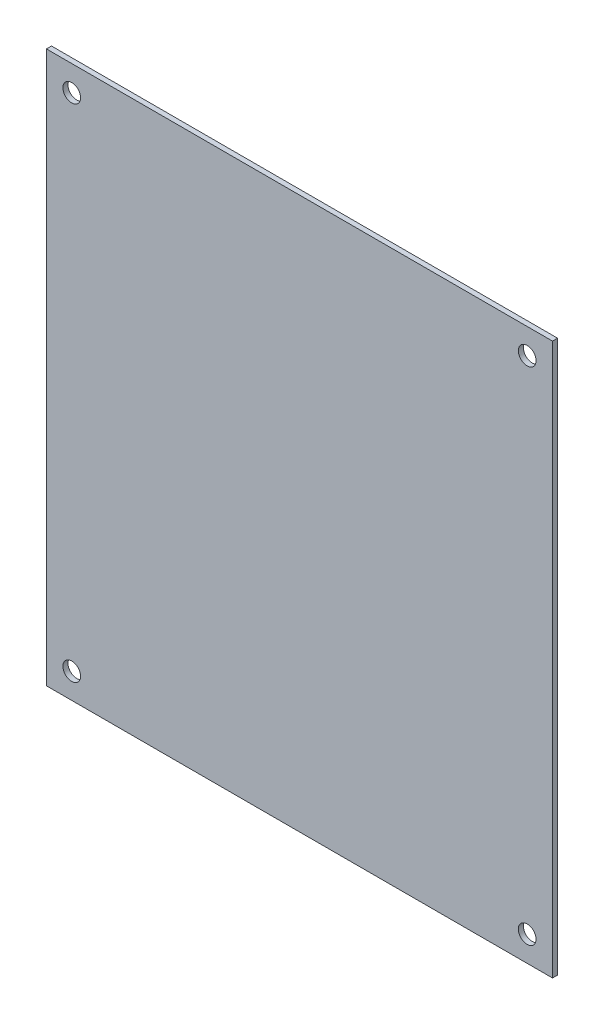
ISO-10303-21;
HEADER;
FILE_DESCRIPTION(('STEP AP214'),'2;1');
FILE_NAME('part.step','',(''),(''),'','','');
FILE_SCHEMA(('AUTOMOTIVE_DESIGN { 1 0 10303 214 1 1 1 1 }'));
ENDSEC;
DATA;
#1=APPLICATION_CONTEXT('core data for automotive mechanical design processes');
#2=APPLICATION_PROTOCOL_DEFINITION('international standard','automotive_design',2000,#1);
#3=PRODUCT_CONTEXT('',#1,'mechanical');
#4=PRODUCT('Part','Part','',(#3));
#5=PRODUCT_RELATED_PRODUCT_CATEGORY('part','',(#4));
#6=PRODUCT_DEFINITION_FORMATION('','',#4);
#7=PRODUCT_DEFINITION_CONTEXT('part definition',#1,'design');
#8=PRODUCT_DEFINITION('design','',#6,#7);
#9=PRODUCT_DEFINITION_SHAPE('','',#8);
#10=(LENGTH_UNIT() NAMED_UNIT(*) SI_UNIT(.MILLI.,.METRE.));
#11=(NAMED_UNIT(*) PLANE_ANGLE_UNIT() SI_UNIT($,.RADIAN.));
#12=(NAMED_UNIT(*) SI_UNIT($,.STERADIAN.) SOLID_ANGLE_UNIT());
#13=UNCERTAINTY_MEASURE_WITH_UNIT(LENGTH_MEASURE(1.E-05),#10,'distance_accuracy_value','');
#14=(GEOMETRIC_REPRESENTATION_CONTEXT(3) GLOBAL_UNCERTAINTY_ASSIGNED_CONTEXT((#13)) GLOBAL_UNIT_ASSIGNED_CONTEXT((#10,
#11,#12)) REPRESENTATION_CONTEXT('',''));
#15=CARTESIAN_POINT('',(0.,0.,0.));
#16=DIRECTION('',(0.,0.,1.));
#17=DIRECTION('',(1.,0.,0.));
#18=AXIS2_PLACEMENT_3D('',#15,#16,#17);
#19=CARTESIAN_POINT('',(0.,0.,2.));
#20=DIRECTION('',(1.,0.,0.));
#21=DIRECTION('',(0.,0.,-1.));
#22=AXIS2_PLACEMENT_3D('',#19,#20,#21);
#23=PLANE('',#22);
#24=DIRECTION('',(0.,-1.,0.));
#25=VECTOR('',#24,1.);
#26=CARTESIAN_POINT('',(0.,0.,0.));
#27=LINE('',#26,#25);
#28=CARTESIAN_POINT('',(0.,218.,0.));
#29=VERTEX_POINT('',#28);
#30=CARTESIAN_POINT('',(0.,0.,0.));
#31=VERTEX_POINT('',#30);
#32=EDGE_CURVE('E102',#29,#31,#27,.T.);
#33=ORIENTED_EDGE('',*,*,#32,.T.);
#34=DIRECTION('',(0.,0.,-1.));
#35=VECTOR('',#34,1.);
#36=CARTESIAN_POINT('',(0.,0.,2.));
#37=LINE('',#36,#35);
#38=CARTESIAN_POINT('',(0.,0.,2.));
#39=VERTEX_POINT('',#38);
#40=EDGE_CURVE('E11',#39,#31,#37,.T.);
#41=ORIENTED_EDGE('',*,*,#40,.F.);
#42=DIRECTION('',(0.,-1.,0.));
#43=VECTOR('',#42,1.);
#44=CARTESIAN_POINT('',(0.,0.,2.));
#45=LINE('',#44,#43);
#46=CARTESIAN_POINT('',(0.,218.,2.));
#47=VERTEX_POINT('',#46);
#48=EDGE_CURVE('E90',#47,#39,#45,.T.);
#49=ORIENTED_EDGE('',*,*,#48,.F.);
#50=DIRECTION('',(0.,0.,-1.));
#51=VECTOR('',#50,1.);
#52=CARTESIAN_POINT('',(0.,218.,2.));
#53=LINE('',#52,#51);
#54=EDGE_CURVE('E98',#47,#29,#53,.T.);
#55=ORIENTED_EDGE('',*,*,#54,.T.);
#56=EDGE_LOOP('',(#33,#41,#49,#55));
#57=FACE_BOUND('',#56,.T.);
#58=ADVANCED_FACE('F39',(#57),#23,.F.);
#59=CARTESIAN_POINT('',(0.,0.,2.));
#60=DIRECTION('',(0.,1.,0.));
#61=DIRECTION('',(0.,0.,1.));
#62=AXIS2_PLACEMENT_3D('',#59,#60,#61);
#63=PLANE('',#62);
#64=DIRECTION('',(1.,0.,0.));
#65=VECTOR('',#64,1.);
#66=CARTESIAN_POINT('',(0.,0.,0.));
#67=LINE('',#66,#65);
#68=CARTESIAN_POINT('',(200.,0.,0.));
#69=VERTEX_POINT('',#68);
#70=EDGE_CURVE('E94',#31,#69,#67,.T.);
#71=ORIENTED_EDGE('',*,*,#70,.T.);
#72=DIRECTION('',(0.,0.,-1.));
#73=VECTOR('',#72,1.);
#74=CARTESIAN_POINT('',(200.,0.,2.));
#75=LINE('',#74,#73);
#76=CARTESIAN_POINT('',(200.,0.,2.));
#77=VERTEX_POINT('',#76);
#78=EDGE_CURVE('E47',#77,#69,#75,.T.);
#79=ORIENTED_EDGE('',*,*,#78,.F.);
#80=DIRECTION('',(1.,0.,0.));
#81=VECTOR('',#80,1.);
#82=CARTESIAN_POINT('',(0.,0.,2.));
#83=LINE('',#82,#81);
#84=EDGE_CURVE('E85',#39,#77,#83,.T.);
#85=ORIENTED_EDGE('',*,*,#84,.F.);
#86=ORIENTED_EDGE('',*,*,#40,.T.);
#87=EDGE_LOOP('',(#71,#79,#85,#86));
#88=FACE_BOUND('',#87,.T.);
#89=ADVANCED_FACE('F93',(#88),#63,.F.);
#90=CARTESIAN_POINT('',(200.,0.,2.));
#91=DIRECTION('',(-1.,0.,0.));
#92=DIRECTION('',(0.,0.,1.));
#93=AXIS2_PLACEMENT_3D('',#90,#91,#92);
#94=PLANE('',#93);
#95=DIRECTION('',(0.,1.,0.));
#96=VECTOR('',#95,1.);
#97=CARTESIAN_POINT('',(200.,0.,0.));
#98=LINE('',#97,#96);
#99=CARTESIAN_POINT('',(200.,218.,0.));
#100=VERTEX_POINT('',#99);
#101=EDGE_CURVE('E72',#69,#100,#98,.T.);
#102=ORIENTED_EDGE('',*,*,#101,.T.);
#103=DIRECTION('',(0.,0.,-1.));
#104=VECTOR('',#103,1.);
#105=CARTESIAN_POINT('',(200.,218.,2.));
#106=LINE('',#105,#104);
#107=CARTESIAN_POINT('',(200.,218.,2.));
#108=VERTEX_POINT('',#107);
#109=EDGE_CURVE('E95',#108,#100,#106,.T.);
#110=ORIENTED_EDGE('',*,*,#109,.F.);
#111=DIRECTION('',(0.,1.,0.));
#112=VECTOR('',#111,1.);
#113=CARTESIAN_POINT('',(200.,0.,2.));
#114=LINE('',#113,#112);
#115=EDGE_CURVE('E88',#77,#108,#114,.T.);
#116=ORIENTED_EDGE('',*,*,#115,.F.);
#117=ORIENTED_EDGE('',*,*,#78,.T.);
#118=EDGE_LOOP('',(#102,#110,#116,#117));
#119=FACE_BOUND('',#118,.T.);
#120=ADVANCED_FACE('F96',(#119),#94,.F.);
#121=CARTESIAN_POINT('',(0.,218.,2.));
#122=DIRECTION('',(0.,-1.,0.));
#123=DIRECTION('',(0.,0.,-1.));
#124=AXIS2_PLACEMENT_3D('',#121,#122,#123);
#125=PLANE('',#124);
#126=DIRECTION('',(-1.,0.,0.));
#127=VECTOR('',#126,1.);
#128=CARTESIAN_POINT('',(0.,218.,0.));
#129=LINE('',#128,#127);
#130=EDGE_CURVE('E78',#100,#29,#129,.T.);
#131=ORIENTED_EDGE('',*,*,#130,.T.);
#132=ORIENTED_EDGE('',*,*,#54,.F.);
#133=DIRECTION('',(-1.,0.,0.));
#134=VECTOR('',#133,1.);
#135=CARTESIAN_POINT('',(0.,218.,2.));
#136=LINE('',#135,#134);
#137=EDGE_CURVE('E55',#108,#47,#136,.T.);
#138=ORIENTED_EDGE('',*,*,#137,.F.);
#139=ORIENTED_EDGE('',*,*,#109,.T.);
#140=EDGE_LOOP('',(#131,#132,#138,#139));
#141=FACE_BOUND('',#140,.T.);
#142=ADVANCED_FACE('F110',(#141),#125,.F.);
#143=CARTESIAN_POINT('',(0.,0.,2.));
#144=DIRECTION('',(0.,0.,-1.));
#145=DIRECTION('',(-1.,0.,0.));
#146=AXIS2_PLACEMENT_3D('',#143,#144,#145);
#147=PLANE('',#146);
#148=CARTESIAN_POINT('',(10.,10.,2.));
#149=DIRECTION('',(0.,0.,1.));
#150=DIRECTION('',(-1.,0.,0.));
#151=AXIS2_PLACEMENT_3D('',#148,#149,#150);
#152=CIRCLE('',#151,3.5);
#153=CARTESIAN_POINT('',(6.50000000000001,10.,2.));
#154=VERTEX_POINT('',#153);
#155=EDGE_CURVE('E125',#154,#154,#152,.T.);
#156=ORIENTED_EDGE('',*,*,#155,.F.);
#157=EDGE_LOOP('',(#156));
#158=FACE_BOUND('',#157,.T.);
#159=CARTESIAN_POINT('',(190.,10.,2.));
#160=DIRECTION('',(0.,0.,1.));
#161=DIRECTION('',(1.,0.,0.));
#162=AXIS2_PLACEMENT_3D('',#159,#160,#161);
#163=CIRCLE('',#162,3.49999999999999);
#164=CARTESIAN_POINT('',(193.5,10.,2.));
#165=VERTEX_POINT('',#164);
#166=EDGE_CURVE('E131',#165,#165,#163,.T.);
#167=ORIENTED_EDGE('',*,*,#166,.F.);
#168=EDGE_LOOP('',(#167));
#169=FACE_BOUND('',#168,.T.);
#170=CARTESIAN_POINT('',(190.,208.,2.));
#171=DIRECTION('',(0.,0.,1.));
#172=DIRECTION('',(-1.,0.,0.));
#173=AXIS2_PLACEMENT_3D('',#170,#171,#172);
#174=CIRCLE('',#173,3.49999999999999);
#175=CARTESIAN_POINT('',(186.5,208.,2.));
#176=VERTEX_POINT('',#175);
#177=EDGE_CURVE('E119',#176,#176,#174,.T.);
#178=ORIENTED_EDGE('',*,*,#177,.F.);
#179=EDGE_LOOP('',(#178));
#180=FACE_BOUND('',#179,.T.);
#181=CARTESIAN_POINT('',(10.,208.,2.));
#182=DIRECTION('',(0.,0.,1.));
#183=DIRECTION('',(1.,0.,0.));
#184=AXIS2_PLACEMENT_3D('',#181,#182,#183);
#185=CIRCLE('',#184,3.5);
#186=CARTESIAN_POINT('',(13.5,208.,2.));
#187=VERTEX_POINT('',#186);
#188=EDGE_CURVE('E116',#187,#187,#185,.T.);
#189=ORIENTED_EDGE('',*,*,#188,.F.);
#190=EDGE_LOOP('',(#189));
#191=FACE_BOUND('',#190,.T.);
#192=ORIENTED_EDGE('',*,*,#48,.T.);
#193=ORIENTED_EDGE('',*,*,#84,.T.);
#194=ORIENTED_EDGE('',*,*,#115,.T.);
#195=ORIENTED_EDGE('',*,*,#137,.T.);
#196=EDGE_LOOP('',(#192,#193,#194,#195));
#197=FACE_BOUND('',#196,.T.);
#198=ADVANCED_FACE('F86',(#158,#169,#180,#191,#197),#147,.F.);
#199=CARTESIAN_POINT('',(0.,0.,0.));
#200=DIRECTION('',(0.,0.,-1.));
#201=DIRECTION('',(-1.,0.,0.));
#202=AXIS2_PLACEMENT_3D('',#199,#200,#201);
#203=PLANE('',#202);
#204=CARTESIAN_POINT('',(10.,10.,0.));
#205=DIRECTION('',(0.,0.,1.));
#206=DIRECTION('',(-1.,0.,0.));
#207=AXIS2_PLACEMENT_3D('',#204,#205,#206);
#208=CIRCLE('',#207,3.5);
#209=CARTESIAN_POINT('',(6.50000000000001,10.,0.));
#210=VERTEX_POINT('',#209);
#211=EDGE_CURVE('E122',#210,#210,#208,.T.);
#212=ORIENTED_EDGE('',*,*,#211,.T.);
#213=EDGE_LOOP('',(#212));
#214=FACE_BOUND('',#213,.T.);
#215=CARTESIAN_POINT('',(190.,10.,0.));
#216=DIRECTION('',(0.,0.,1.));
#217=DIRECTION('',(1.,0.,0.));
#218=AXIS2_PLACEMENT_3D('',#215,#216,#217);
#219=CIRCLE('',#218,3.49999999999999);
#220=CARTESIAN_POINT('',(193.5,10.,0.));
#221=VERTEX_POINT('',#220);
#222=EDGE_CURVE('E128',#221,#221,#219,.T.);
#223=ORIENTED_EDGE('',*,*,#222,.T.);
#224=EDGE_LOOP('',(#223));
#225=FACE_BOUND('',#224,.T.);
#226=CARTESIAN_POINT('',(190.,208.,0.));
#227=DIRECTION('',(0.,0.,1.));
#228=DIRECTION('',(-1.,0.,0.));
#229=AXIS2_PLACEMENT_3D('',#226,#227,#228);
#230=CIRCLE('',#229,3.49999999999999);
#231=CARTESIAN_POINT('',(186.5,208.,0.));
#232=VERTEX_POINT('',#231);
#233=EDGE_CURVE('E134',#232,#232,#230,.T.);
#234=ORIENTED_EDGE('',*,*,#233,.T.);
#235=EDGE_LOOP('',(#234));
#236=FACE_BOUND('',#235,.T.);
#237=CARTESIAN_POINT('',(10.,208.,0.));
#238=DIRECTION('',(0.,0.,1.));
#239=DIRECTION('',(1.,0.,0.));
#240=AXIS2_PLACEMENT_3D('',#237,#238,#239);
#241=CIRCLE('',#240,3.5);
#242=CARTESIAN_POINT('',(13.5,208.,0.));
#243=VERTEX_POINT('',#242);
#244=EDGE_CURVE('E105',#243,#243,#241,.T.);
#245=ORIENTED_EDGE('',*,*,#244,.T.);
#246=EDGE_LOOP('',(#245));
#247=FACE_BOUND('',#246,.T.);
#248=ORIENTED_EDGE('',*,*,#32,.F.);
#249=ORIENTED_EDGE('',*,*,#130,.F.);
#250=ORIENTED_EDGE('',*,*,#101,.F.);
#251=ORIENTED_EDGE('',*,*,#70,.F.);
#252=EDGE_LOOP('',(#248,#249,#250,#251));
#253=FACE_BOUND('',#252,.T.);
#254=ADVANCED_FACE('F113',(#214,#225,#236,#247,#253),#203,.T.);
#255=CARTESIAN_POINT('',(10.,208.,0.));
#256=DIRECTION('',(0.,0.,1.));
#257=DIRECTION('',(1.,0.,0.));
#258=AXIS2_PLACEMENT_3D('',#255,#256,#257);
#259=CYLINDRICAL_SURFACE('',#258,3.5);
#260=ORIENTED_EDGE('',*,*,#244,.F.);
#261=EDGE_LOOP('',(#260));
#262=FACE_BOUND('',#261,.T.);
#263=ORIENTED_EDGE('',*,*,#188,.T.);
#264=EDGE_LOOP('',(#263));
#265=FACE_BOUND('',#264,.T.);
#266=ADVANCED_FACE('F148',(#262,#265),#259,.F.);
#267=CARTESIAN_POINT('',(190.,208.,0.));
#268=DIRECTION('',(0.,0.,1.));
#269=DIRECTION('',(1.,0.,0.));
#270=AXIS2_PLACEMENT_3D('',#267,#268,#269);
#271=CYLINDRICAL_SURFACE('',#270,3.49999999999999);
#272=ORIENTED_EDGE('',*,*,#233,.F.);
#273=EDGE_LOOP('',(#272));
#274=FACE_BOUND('',#273,.T.);
#275=ORIENTED_EDGE('',*,*,#177,.T.);
#276=EDGE_LOOP('',(#275));
#277=FACE_BOUND('',#276,.T.);
#278=ADVANCED_FACE('F140',(#274,#277),#271,.F.);
#279=CARTESIAN_POINT('',(190.,10.,0.));
#280=DIRECTION('',(0.,0.,1.));
#281=DIRECTION('',(1.,0.,0.));
#282=AXIS2_PLACEMENT_3D('',#279,#280,#281);
#283=CYLINDRICAL_SURFACE('',#282,3.49999999999999);
#284=ORIENTED_EDGE('',*,*,#222,.F.);
#285=EDGE_LOOP('',(#284));
#286=FACE_BOUND('',#285,.T.);
#287=ORIENTED_EDGE('',*,*,#166,.T.);
#288=EDGE_LOOP('',(#287));
#289=FACE_BOUND('',#288,.T.);
#290=ADVANCED_FACE('F156',(#286,#289),#283,.F.);
#291=CARTESIAN_POINT('',(10.,10.,0.));
#292=DIRECTION('',(0.,0.,1.));
#293=DIRECTION('',(1.,0.,0.));
#294=AXIS2_PLACEMENT_3D('',#291,#292,#293);
#295=CYLINDRICAL_SURFACE('',#294,3.5);
#296=ORIENTED_EDGE('',*,*,#211,.F.);
#297=EDGE_LOOP('',(#296));
#298=FACE_BOUND('',#297,.T.);
#299=ORIENTED_EDGE('',*,*,#155,.T.);
#300=EDGE_LOOP('',(#299));
#301=FACE_BOUND('',#300,.T.);
#302=ADVANCED_FACE('F207',(#298,#301),#295,.F.);
#303=CLOSED_SHELL('',(#58,#89,#120,#142,#198,#254,#266,#278,#290,#302));
#304=MANIFOLD_SOLID_BREP('B2',#303);
#305=ADVANCED_BREP_SHAPE_REPRESENTATION('',(#18,#304),#14);
#306=SHAPE_DEFINITION_REPRESENTATION(#9,#305);
ENDSEC;
END-ISO-10303-21;
